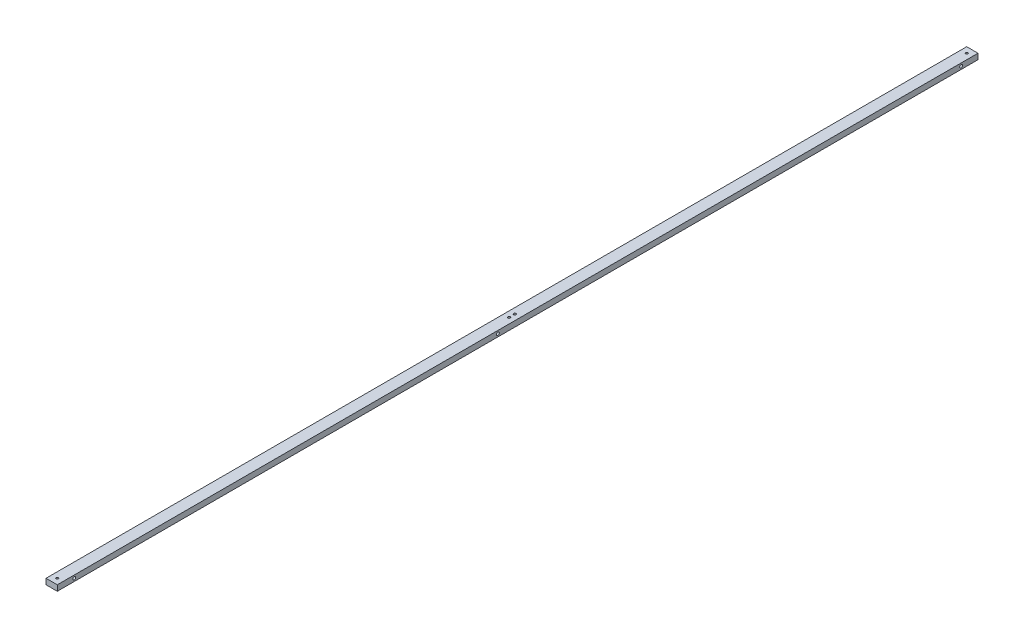
ISO-10303-21;
HEADER;
FILE_DESCRIPTION(('STEP AP214'),'2;1');
FILE_NAME('part.step','',(''),(''),'','','');
FILE_SCHEMA(('AUTOMOTIVE_DESIGN { 1 0 10303 214 1 1 1 1 }'));
ENDSEC;
DATA;
#1=APPLICATION_CONTEXT('core data for automotive mechanical design processes');
#2=APPLICATION_PROTOCOL_DEFINITION('international standard','automotive_design',2000,#1);
#3=PRODUCT_CONTEXT('',#1,'mechanical');
#4=PRODUCT('Part','Part','',(#3));
#5=PRODUCT_RELATED_PRODUCT_CATEGORY('part','',(#4));
#6=PRODUCT_DEFINITION_FORMATION('','',#4);
#7=PRODUCT_DEFINITION_CONTEXT('part definition',#1,'design');
#8=PRODUCT_DEFINITION('design','',#6,#7);
#9=PRODUCT_DEFINITION_SHAPE('','',#8);
#10=(LENGTH_UNIT() NAMED_UNIT(*) SI_UNIT(.MILLI.,.METRE.));
#11=(NAMED_UNIT(*) PLANE_ANGLE_UNIT() SI_UNIT($,.RADIAN.));
#12=(NAMED_UNIT(*) SI_UNIT($,.STERADIAN.) SOLID_ANGLE_UNIT());
#13=UNCERTAINTY_MEASURE_WITH_UNIT(LENGTH_MEASURE(1.E-05),#10,'distance_accuracy_value','');
#14=(GEOMETRIC_REPRESENTATION_CONTEXT(3) GLOBAL_UNCERTAINTY_ASSIGNED_CONTEXT((#13)) GLOBAL_UNIT_ASSIGNED_CONTEXT((#10,
#11,#12)) REPRESENTATION_CONTEXT('',''));
#15=CARTESIAN_POINT('',(0.,0.,0.));
#16=DIRECTION('',(0.,0.,1.));
#17=DIRECTION('',(1.,0.,0.));
#18=AXIS2_PLACEMENT_3D('',#15,#16,#17);
#19=CARTESIAN_POINT('',(12.7,5.715,12.6999999999998));
#20=DIRECTION('',(0.,-1.,0.));
#21=DIRECTION('',(0.,0.,1.));
#22=AXIS2_PLACEMENT_3D('',#19,#20,#21);
#23=CYLINDRICAL_SURFACE('',#22,2.55905);
#24=CARTESIAN_POINT('',(12.7,12.7,12.6999999999998));
#25=DIRECTION('',(0.,-1.,0.));
#26=DIRECTION('',(0.,0.,1.));
#27=AXIS2_PLACEMENT_3D('',#24,#25,#26);
#28=CIRCLE('',#27,2.55905);
#29=CARTESIAN_POINT('',(12.7,12.7,10.1409499999998));
#30=VERTEX_POINT('',#29);
#31=EDGE_CURVE('E163',#30,#30,#28,.T.);
#32=ORIENTED_EDGE('',*,*,#31,.F.);
#33=DIRECTION('',(0.,-1.,0.));
#34=VECTOR('',#33,1.);
#35=CARTESIAN_POINT('',(12.7,5.715,10.1409499999998));
#36=LINE('',#35,#34);
#37=CARTESIAN_POINT('',(12.7,0.,10.1409499999998));
#38=VERTEX_POINT('',#37);
#39=EDGE_CURVE('E9',#30,#38,#36,.T.);
#40=ORIENTED_EDGE('',*,*,#39,.T.);
#41=CARTESIAN_POINT('',(12.7,0.,12.6999999999998));
#42=DIRECTION('',(0.,1.,0.));
#43=DIRECTION('',(0.,0.,1.));
#44=AXIS2_PLACEMENT_3D('',#41,#42,#43);
#45=CIRCLE('',#44,2.55905);
#46=EDGE_CURVE('E149',#38,#38,#45,.T.);
#47=ORIENTED_EDGE('',*,*,#46,.F.);
#48=ORIENTED_EDGE('',*,*,#39,.F.);
#49=EDGE_LOOP('',(#32,#40,#47,#48));
#50=FACE_BOUND('',#49,.T.);
#51=ADVANCED_FACE('F17',(#50),#23,.F.);
#52=CARTESIAN_POINT('',(12.7,5.715,1028.7));
#53=DIRECTION('',(0.,-1.,0.));
#54=DIRECTION('',(0.,0.,1.));
#55=AXIS2_PLACEMENT_3D('',#52,#53,#54);
#56=CYLINDRICAL_SURFACE('',#55,2.55905);
#57=CARTESIAN_POINT('',(12.7,12.7,1028.7));
#58=DIRECTION('',(0.,-1.,0.));
#59=DIRECTION('',(0.,0.,1.));
#60=AXIS2_PLACEMENT_3D('',#57,#58,#59);
#61=CIRCLE('',#60,2.55905);
#62=CARTESIAN_POINT('',(12.7,12.7,1026.14095));
#63=VERTEX_POINT('',#62);
#64=EDGE_CURVE('E248',#63,#63,#61,.T.);
#65=ORIENTED_EDGE('',*,*,#64,.F.);
#66=DIRECTION('',(0.,-1.,0.));
#67=VECTOR('',#66,1.);
#68=CARTESIAN_POINT('',(12.7,5.715,1026.14095));
#69=LINE('',#68,#67);
#70=CARTESIAN_POINT('',(12.7,0.,1026.14095));
#71=VERTEX_POINT('',#70);
#72=EDGE_CURVE('E28',#63,#71,#69,.T.);
#73=ORIENTED_EDGE('',*,*,#72,.T.);
#74=CARTESIAN_POINT('',(12.7,0.,1028.7));
#75=DIRECTION('',(0.,1.,0.));
#76=DIRECTION('',(0.,0.,1.));
#77=AXIS2_PLACEMENT_3D('',#74,#75,#76);
#78=CIRCLE('',#77,2.55905);
#79=EDGE_CURVE('E153',#71,#71,#78,.T.);
#80=ORIENTED_EDGE('',*,*,#79,.F.);
#81=ORIENTED_EDGE('',*,*,#72,.F.);
#82=EDGE_LOOP('',(#65,#73,#80,#81));
#83=FACE_BOUND('',#82,.T.);
#84=ADVANCED_FACE('F288',(#83),#56,.F.);
#85=CARTESIAN_POINT('',(12.7,6.35,0.));
#86=DIRECTION('',(0.,0.,1.));
#87=DIRECTION('',(1.,0.,0.));
#88=AXIS2_PLACEMENT_3D('',#85,#86,#87);
#89=PLANE('',#88);
#90=DIRECTION('',(0.,-1.,0.));
#91=VECTOR('',#90,1.);
#92=CARTESIAN_POINT('',(0.,12.7,0.));
#93=LINE('',#92,#91);
#94=CARTESIAN_POINT('',(0.,12.7,0.));
#95=VERTEX_POINT('',#94);
#96=CARTESIAN_POINT('',(0.,0.,0.));
#97=VERTEX_POINT('',#96);
#98=EDGE_CURVE('E172',#95,#97,#93,.T.);
#99=ORIENTED_EDGE('',*,*,#98,.F.);
#100=DIRECTION('',(-1.,0.,0.));
#101=VECTOR('',#100,1.);
#102=CARTESIAN_POINT('',(25.4,12.7,0.));
#103=LINE('',#102,#101);
#104=CARTESIAN_POINT('',(25.4,12.7,0.));
#105=VERTEX_POINT('',#104);
#106=EDGE_CURVE('E173',#105,#95,#103,.T.);
#107=ORIENTED_EDGE('',*,*,#106,.F.);
#108=DIRECTION('',(0.,1.,0.));
#109=VECTOR('',#108,1.);
#110=CARTESIAN_POINT('',(25.4,0.,0.));
#111=LINE('',#110,#109);
#112=CARTESIAN_POINT('',(25.4,0.,0.));
#113=VERTEX_POINT('',#112);
#114=EDGE_CURVE('E199',#113,#105,#111,.T.);
#115=ORIENTED_EDGE('',*,*,#114,.F.);
#116=DIRECTION('',(1.,0.,0.));
#117=VECTOR('',#116,1.);
#118=CARTESIAN_POINT('',(0.,0.,0.));
#119=LINE('',#118,#117);
#120=EDGE_CURVE('E200',#97,#113,#119,.T.);
#121=ORIENTED_EDGE('',*,*,#120,.F.);
#122=EDGE_LOOP('',(#99,#107,#115,#121));
#123=FACE_BOUND('',#122,.T.);
#124=ADVANCED_FACE('F245',(#123),#89,.F.);
#125=CARTESIAN_POINT('',(12.7,6.35,2070.1));
#126=DIRECTION('',(0.,0.,1.));
#127=DIRECTION('',(1.,0.,0.));
#128=AXIS2_PLACEMENT_3D('',#125,#126,#127);
#129=PLANE('',#128);
#130=DIRECTION('',(0.,-1.,0.));
#131=VECTOR('',#130,1.);
#132=CARTESIAN_POINT('',(0.,12.7,2070.1));
#133=LINE('',#132,#131);
#134=CARTESIAN_POINT('',(0.,12.7,2070.1));
#135=VERTEX_POINT('',#134);
#136=CARTESIAN_POINT('',(0.,0.,2070.1));
#137=VERTEX_POINT('',#136);
#138=EDGE_CURVE('E169',#135,#137,#133,.T.);
#139=ORIENTED_EDGE('',*,*,#138,.T.);
#140=DIRECTION('',(1.,0.,0.));
#141=VECTOR('',#140,1.);
#142=CARTESIAN_POINT('',(0.,0.,2070.1));
#143=LINE('',#142,#141);
#144=CARTESIAN_POINT('',(25.4,0.,2070.1));
#145=VERTEX_POINT('',#144);
#146=EDGE_CURVE('E157',#137,#145,#143,.T.);
#147=ORIENTED_EDGE('',*,*,#146,.T.);
#148=DIRECTION('',(0.,1.,0.));
#149=VECTOR('',#148,1.);
#150=CARTESIAN_POINT('',(25.4,0.,2070.1));
#151=LINE('',#150,#149);
#152=CARTESIAN_POINT('',(25.4,12.7,2070.1));
#153=VERTEX_POINT('',#152);
#154=EDGE_CURVE('E195',#145,#153,#151,.T.);
#155=ORIENTED_EDGE('',*,*,#154,.T.);
#156=DIRECTION('',(-1.,0.,0.));
#157=VECTOR('',#156,1.);
#158=CARTESIAN_POINT('',(25.4,12.7,2070.1));
#159=LINE('',#158,#157);
#160=EDGE_CURVE('E164',#153,#135,#159,.T.);
#161=ORIENTED_EDGE('',*,*,#160,.T.);
#162=EDGE_LOOP('',(#139,#147,#155,#161));
#163=FACE_BOUND('',#162,.T.);
#164=ADVANCED_FACE('F232',(#163),#129,.T.);
#165=CARTESIAN_POINT('',(0.,12.7,0.));
#166=DIRECTION('',(-1.,0.,0.));
#167=DIRECTION('',(0.,0.,1.));
#168=AXIS2_PLACEMENT_3D('',#165,#166,#167);
#169=PLANE('',#168);
#170=CARTESIAN_POINT('',(0.,6.35,2032.));
#171=DIRECTION('',(1.,0.,0.));
#172=DIRECTION('',(0.,1.,0.));
#173=AXIS2_PLACEMENT_3D('',#170,#171,#172);
#174=CIRCLE('',#173,3.175);
#175=CARTESIAN_POINT('',(0.,3.175,2032.));
#176=VERTEX_POINT('',#175);
#177=EDGE_CURVE('E185',#176,#176,#174,.T.);
#178=ORIENTED_EDGE('',*,*,#177,.T.);
#179=EDGE_LOOP('',(#178));
#180=FACE_BOUND('',#179,.T.);
#181=CARTESIAN_POINT('',(0.,6.35,1079.5));
#182=DIRECTION('',(1.,0.,0.));
#183=DIRECTION('',(0.,1.,0.));
#184=AXIS2_PLACEMENT_3D('',#181,#182,#183);
#185=CIRCLE('',#184,3.175);
#186=CARTESIAN_POINT('',(0.,3.175,1079.5));
#187=VERTEX_POINT('',#186);
#188=EDGE_CURVE('E165',#187,#187,#185,.T.);
#189=ORIENTED_EDGE('',*,*,#188,.T.);
#190=EDGE_LOOP('',(#189));
#191=FACE_BOUND('',#190,.T.);
#192=CARTESIAN_POINT('',(0.,6.35,38.1));
#193=DIRECTION('',(1.,0.,0.));
#194=DIRECTION('',(0.,1.,0.));
#195=AXIS2_PLACEMENT_3D('',#192,#193,#194);
#196=CIRCLE('',#195,3.175);
#197=CARTESIAN_POINT('',(0.,3.175,38.1));
#198=VERTEX_POINT('',#197);
#199=EDGE_CURVE('E147',#198,#198,#196,.T.);
#200=ORIENTED_EDGE('',*,*,#199,.T.);
#201=EDGE_LOOP('',(#200));
#202=FACE_BOUND('',#201,.T.);
#203=ORIENTED_EDGE('',*,*,#98,.T.);
#204=DIRECTION('',(0.,0.,1.));
#205=VECTOR('',#204,1.);
#206=CARTESIAN_POINT('',(0.,0.,0.));
#207=LINE('',#206,#205);
#208=EDGE_CURVE('E154',#97,#137,#207,.T.);
#209=ORIENTED_EDGE('',*,*,#208,.T.);
#210=ORIENTED_EDGE('',*,*,#138,.F.);
#211=DIRECTION('',(0.,0.,1.));
#212=VECTOR('',#211,1.);
#213=CARTESIAN_POINT('',(0.,12.7,0.));
#214=LINE('',#213,#212);
#215=EDGE_CURVE('E177',#95,#135,#214,.T.);
#216=ORIENTED_EDGE('',*,*,#215,.F.);
#217=EDGE_LOOP('',(#203,#209,#210,#216));
#218=FACE_BOUND('',#217,.T.);
#219=ADVANCED_FACE('F229',(#180,#191,#202,#218),#169,.T.);
#220=CARTESIAN_POINT('',(0.,0.,0.));
#221=DIRECTION('',(0.,-1.,0.));
#222=DIRECTION('',(-1.,0.,0.));
#223=AXIS2_PLACEMENT_3D('',#220,#221,#222);
#224=PLANE('',#223);
#225=CARTESIAN_POINT('',(12.7,0.,2057.4));
#226=DIRECTION('',(0.,1.,0.));
#227=DIRECTION('',(0.,0.,1.));
#228=AXIS2_PLACEMENT_3D('',#225,#226,#227);
#229=CIRCLE('',#228,2.55905);
#230=CARTESIAN_POINT('',(12.7,0.,2054.84095));
#231=VERTEX_POINT('',#230);
#232=EDGE_CURVE('E21',#231,#231,#229,.T.);
#233=ORIENTED_EDGE('',*,*,#232,.T.);
#234=EDGE_LOOP('',(#233));
#235=FACE_BOUND('',#234,.T.);
#236=CARTESIAN_POINT('',(12.7,0.,1041.4));
#237=DIRECTION('',(0.,1.,0.));
#238=DIRECTION('',(0.,0.,1.));
#239=AXIS2_PLACEMENT_3D('',#236,#237,#238);
#240=CIRCLE('',#239,2.55905);
#241=CARTESIAN_POINT('',(12.7,0.,1038.84095));
#242=VERTEX_POINT('',#241);
#243=EDGE_CURVE('E122',#242,#242,#240,.T.);
#244=ORIENTED_EDGE('',*,*,#243,.T.);
#245=EDGE_LOOP('',(#244));
#246=FACE_BOUND('',#245,.T.);
#247=ORIENTED_EDGE('',*,*,#79,.T.);
#248=EDGE_LOOP('',(#247));
#249=FACE_BOUND('',#248,.T.);
#250=ORIENTED_EDGE('',*,*,#46,.T.);
#251=EDGE_LOOP('',(#250));
#252=FACE_BOUND('',#251,.T.);
#253=ORIENTED_EDGE('',*,*,#120,.T.);
#254=DIRECTION('',(0.,0.,1.));
#255=VECTOR('',#254,1.);
#256=CARTESIAN_POINT('',(25.4,0.,0.));
#257=LINE('',#256,#255);
#258=EDGE_CURVE('E198',#113,#145,#257,.T.);
#259=ORIENTED_EDGE('',*,*,#258,.T.);
#260=ORIENTED_EDGE('',*,*,#146,.F.);
#261=ORIENTED_EDGE('',*,*,#208,.F.);
#262=EDGE_LOOP('',(#253,#259,#260,#261));
#263=FACE_BOUND('',#262,.T.);
#264=ADVANCED_FACE('F19',(#235,#246,#249,#252,#263),#224,.T.);
#265=CARTESIAN_POINT('',(25.4,0.,0.));
#266=DIRECTION('',(1.,0.,0.));
#267=DIRECTION('',(0.,1.,0.));
#268=AXIS2_PLACEMENT_3D('',#265,#266,#267);
#269=PLANE('',#268);
#270=CARTESIAN_POINT('',(25.4,6.35,2032.));
#271=DIRECTION('',(-1.,0.,0.));
#272=DIRECTION('',(0.,1.,0.));
#273=AXIS2_PLACEMENT_3D('',#270,#271,#272);
#274=CIRCLE('',#273,3.175);
#275=CARTESIAN_POINT('',(25.4,3.175,2032.));
#276=VERTEX_POINT('',#275);
#277=EDGE_CURVE('E168',#276,#276,#274,.T.);
#278=ORIENTED_EDGE('',*,*,#277,.T.);
#279=EDGE_LOOP('',(#278));
#280=FACE_BOUND('',#279,.T.);
#281=CARTESIAN_POINT('',(25.4,6.35,1079.5));
#282=DIRECTION('',(-1.,0.,0.));
#283=DIRECTION('',(0.,1.,0.));
#284=AXIS2_PLACEMENT_3D('',#281,#282,#283);
#285=CIRCLE('',#284,3.175);
#286=CARTESIAN_POINT('',(25.4,3.175,1079.5));
#287=VERTEX_POINT('',#286);
#288=EDGE_CURVE('E143',#287,#287,#285,.T.);
#289=ORIENTED_EDGE('',*,*,#288,.T.);
#290=EDGE_LOOP('',(#289));
#291=FACE_BOUND('',#290,.T.);
#292=CARTESIAN_POINT('',(25.4,6.35,38.1));
#293=DIRECTION('',(-1.,0.,0.));
#294=DIRECTION('',(0.,1.,0.));
#295=AXIS2_PLACEMENT_3D('',#292,#293,#294);
#296=CIRCLE('',#295,3.175);
#297=CARTESIAN_POINT('',(25.4,3.175,38.1));
#298=VERTEX_POINT('',#297);
#299=EDGE_CURVE('E216',#298,#298,#296,.T.);
#300=ORIENTED_EDGE('',*,*,#299,.T.);
#301=EDGE_LOOP('',(#300));
#302=FACE_BOUND('',#301,.T.);
#303=ORIENTED_EDGE('',*,*,#114,.T.);
#304=DIRECTION('',(0.,0.,1.));
#305=VECTOR('',#304,1.);
#306=CARTESIAN_POINT('',(25.4,12.7,0.));
#307=LINE('',#306,#305);
#308=EDGE_CURVE('E159',#105,#153,#307,.T.);
#309=ORIENTED_EDGE('',*,*,#308,.T.);
#310=ORIENTED_EDGE('',*,*,#154,.F.);
#311=ORIENTED_EDGE('',*,*,#258,.F.);
#312=EDGE_LOOP('',(#303,#309,#310,#311));
#313=FACE_BOUND('',#312,.T.);
#314=ADVANCED_FACE('F223',(#280,#291,#302,#313),#269,.T.);
#315=CARTESIAN_POINT('',(25.4,12.7,0.));
#316=DIRECTION('',(0.,1.,0.));
#317=DIRECTION('',(1.,0.,0.));
#318=AXIS2_PLACEMENT_3D('',#315,#316,#317);
#319=PLANE('',#318);
#320=CARTESIAN_POINT('',(12.7,12.7,2057.4));
#321=DIRECTION('',(0.,-1.,0.));
#322=DIRECTION('',(0.,0.,1.));
#323=AXIS2_PLACEMENT_3D('',#320,#321,#322);
#324=CIRCLE('',#323,2.55905);
#325=CARTESIAN_POINT('',(12.7,12.7,2054.84095));
#326=VERTEX_POINT('',#325);
#327=EDGE_CURVE('E127',#326,#326,#324,.T.);
#328=ORIENTED_EDGE('',*,*,#327,.T.);
#329=EDGE_LOOP('',(#328));
#330=FACE_BOUND('',#329,.T.);
#331=CARTESIAN_POINT('',(12.7,12.7,1041.4));
#332=DIRECTION('',(0.,-1.,0.));
#333=DIRECTION('',(0.,0.,1.));
#334=AXIS2_PLACEMENT_3D('',#331,#332,#333);
#335=CIRCLE('',#334,2.55905);
#336=CARTESIAN_POINT('',(12.7,12.7,1038.84095));
#337=VERTEX_POINT('',#336);
#338=EDGE_CURVE('E138',#337,#337,#335,.T.);
#339=ORIENTED_EDGE('',*,*,#338,.T.);
#340=EDGE_LOOP('',(#339));
#341=FACE_BOUND('',#340,.T.);
#342=ORIENTED_EDGE('',*,*,#64,.T.);
#343=EDGE_LOOP('',(#342));
#344=FACE_BOUND('',#343,.T.);
#345=ORIENTED_EDGE('',*,*,#31,.T.);
#346=EDGE_LOOP('',(#345));
#347=FACE_BOUND('',#346,.T.);
#348=ORIENTED_EDGE('',*,*,#106,.T.);
#349=ORIENTED_EDGE('',*,*,#215,.T.);
#350=ORIENTED_EDGE('',*,*,#160,.F.);
#351=ORIENTED_EDGE('',*,*,#308,.F.);
#352=EDGE_LOOP('',(#348,#349,#350,#351));
#353=FACE_BOUND('',#352,.T.);
#354=ADVANCED_FACE('F272',(#330,#341,#344,#347,#353),#319,.T.);
#355=CARTESIAN_POINT('',(12.7,5.715,2057.4));
#356=DIRECTION('',(0.,-1.,0.));
#357=DIRECTION('',(0.,0.,1.));
#358=AXIS2_PLACEMENT_3D('',#355,#356,#357);
#359=CYLINDRICAL_SURFACE('',#358,2.55905);
#360=ORIENTED_EDGE('',*,*,#327,.F.);
#361=DIRECTION('',(0.,-1.,0.));
#362=VECTOR('',#361,1.);
#363=CARTESIAN_POINT('',(12.7,5.715,2054.84095));
#364=LINE('',#363,#362);
#365=EDGE_CURVE('E136',#326,#231,#364,.T.);
#366=ORIENTED_EDGE('',*,*,#365,.T.);
#367=ORIENTED_EDGE('',*,*,#232,.F.);
#368=ORIENTED_EDGE('',*,*,#365,.F.);
#369=EDGE_LOOP('',(#360,#366,#367,#368));
#370=FACE_BOUND('',#369,.T.);
#371=ADVANCED_FACE('F281',(#370),#359,.F.);
#372=CARTESIAN_POINT('',(12.7,5.715,1041.4));
#373=DIRECTION('',(0.,-1.,0.));
#374=DIRECTION('',(0.,0.,1.));
#375=AXIS2_PLACEMENT_3D('',#372,#373,#374);
#376=CYLINDRICAL_SURFACE('',#375,2.55905);
#377=ORIENTED_EDGE('',*,*,#338,.F.);
#378=DIRECTION('',(0.,-1.,0.));
#379=VECTOR('',#378,1.);
#380=CARTESIAN_POINT('',(12.7,5.715,1038.84095));
#381=LINE('',#380,#379);
#382=EDGE_CURVE('E128',#337,#242,#381,.T.);
#383=ORIENTED_EDGE('',*,*,#382,.T.);
#384=ORIENTED_EDGE('',*,*,#243,.F.);
#385=ORIENTED_EDGE('',*,*,#382,.F.);
#386=EDGE_LOOP('',(#377,#383,#384,#385));
#387=FACE_BOUND('',#386,.T.);
#388=ADVANCED_FACE('F297',(#387),#376,.F.);
#389=CARTESIAN_POINT('',(11.43,6.35,2032.));
#390=DIRECTION('',(-1.,0.,0.));
#391=DIRECTION('',(0.,1.,0.));
#392=AXIS2_PLACEMENT_3D('',#389,#390,#391);
#393=CYLINDRICAL_SURFACE('',#392,3.175);
#394=ORIENTED_EDGE('',*,*,#277,.F.);
#395=DIRECTION('',(-1.,0.,0.));
#396=VECTOR('',#395,1.);
#397=CARTESIAN_POINT('',(11.43,3.175,2032.));
#398=LINE('',#397,#396);
#399=EDGE_CURVE('E188',#276,#176,#398,.T.);
#400=ORIENTED_EDGE('',*,*,#399,.T.);
#401=ORIENTED_EDGE('',*,*,#177,.F.);
#402=ORIENTED_EDGE('',*,*,#399,.F.);
#403=EDGE_LOOP('',(#394,#400,#401,#402));
#404=FACE_BOUND('',#403,.T.);
#405=ADVANCED_FACE('F303',(#404),#393,.F.);
#406=CARTESIAN_POINT('',(8.89,6.35,1079.5));
#407=DIRECTION('',(-1.,0.,0.));
#408=DIRECTION('',(0.,1.,0.));
#409=AXIS2_PLACEMENT_3D('',#406,#407,#408);
#410=CYLINDRICAL_SURFACE('',#409,3.175);
#411=ORIENTED_EDGE('',*,*,#288,.F.);
#412=DIRECTION('',(-1.,0.,0.));
#413=VECTOR('',#412,1.);
#414=CARTESIAN_POINT('',(8.89,3.175,1079.5));
#415=LINE('',#414,#413);
#416=EDGE_CURVE('E146',#287,#187,#415,.T.);
#417=ORIENTED_EDGE('',*,*,#416,.T.);
#418=ORIENTED_EDGE('',*,*,#188,.F.);
#419=ORIENTED_EDGE('',*,*,#416,.F.);
#420=EDGE_LOOP('',(#411,#417,#418,#419));
#421=FACE_BOUND('',#420,.T.);
#422=ADVANCED_FACE('F300',(#421),#410,.F.);
#423=CARTESIAN_POINT('',(11.43,6.35,38.1));
#424=DIRECTION('',(-1.,0.,0.));
#425=DIRECTION('',(0.,1.,0.));
#426=AXIS2_PLACEMENT_3D('',#423,#424,#425);
#427=CYLINDRICAL_SURFACE('',#426,3.175);
#428=ORIENTED_EDGE('',*,*,#299,.F.);
#429=DIRECTION('',(-1.,0.,0.));
#430=VECTOR('',#429,1.);
#431=CARTESIAN_POINT('',(11.43,3.175,38.1));
#432=LINE('',#431,#430);
#433=EDGE_CURVE('E184',#298,#198,#432,.T.);
#434=ORIENTED_EDGE('',*,*,#433,.T.);
#435=ORIENTED_EDGE('',*,*,#199,.F.);
#436=ORIENTED_EDGE('',*,*,#433,.F.);
#437=EDGE_LOOP('',(#428,#434,#435,#436));
#438=FACE_BOUND('',#437,.T.);
#439=ADVANCED_FACE('F226',(#438),#427,.F.);
#440=CLOSED_SHELL('',(#51,#84,#124,#164,#219,#264,#314,#354,#371,#388,#405,#422,#439));
#441=MANIFOLD_SOLID_BREP('B1',#440);
#442=ADVANCED_BREP_SHAPE_REPRESENTATION('',(#18,#441),#14);
#443=SHAPE_DEFINITION_REPRESENTATION(#9,#442);
ENDSEC;
END-ISO-10303-21;
